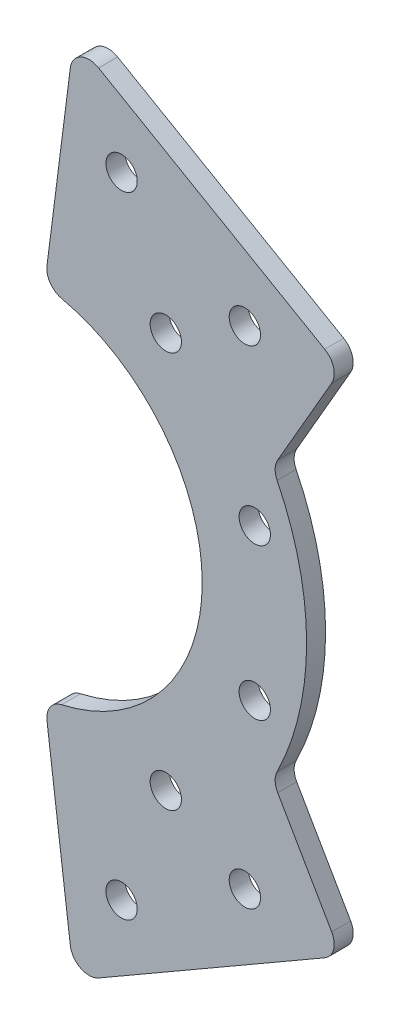
ISO-10303-21;
HEADER;
FILE_DESCRIPTION(('STEP AP214'),'2;1');
FILE_NAME('part.step','',(''),(''),'','','');
FILE_SCHEMA(('AUTOMOTIVE_DESIGN { 1 0 10303 214 1 1 1 1 }'));
ENDSEC;
DATA;
#1=APPLICATION_CONTEXT('core data for automotive mechanical design processes');
#2=APPLICATION_PROTOCOL_DEFINITION('international standard','automotive_design',2000,#1);
#3=PRODUCT_CONTEXT('',#1,'mechanical');
#4=PRODUCT('Part','Part','',(#3));
#5=PRODUCT_RELATED_PRODUCT_CATEGORY('part','',(#4));
#6=PRODUCT_DEFINITION_FORMATION('','',#4);
#7=PRODUCT_DEFINITION_CONTEXT('part definition',#1,'design');
#8=PRODUCT_DEFINITION('design','',#6,#7);
#9=PRODUCT_DEFINITION_SHAPE('','',#8);
#10=(LENGTH_UNIT() NAMED_UNIT(*) SI_UNIT(.MILLI.,.METRE.));
#11=(NAMED_UNIT(*) PLANE_ANGLE_UNIT() SI_UNIT($,.RADIAN.));
#12=(NAMED_UNIT(*) SI_UNIT($,.STERADIAN.) SOLID_ANGLE_UNIT());
#13=UNCERTAINTY_MEASURE_WITH_UNIT(LENGTH_MEASURE(1.E-05),#10,'distance_accuracy_value','');
#14=(GEOMETRIC_REPRESENTATION_CONTEXT(3) GLOBAL_UNCERTAINTY_ASSIGNED_CONTEXT((#13)) GLOBAL_UNIT_ASSIGNED_CONTEXT((#10,
#11,#12)) REPRESENTATION_CONTEXT('',''));
#15=CARTESIAN_POINT('',(0.,0.,0.));
#16=DIRECTION('',(0.,0.,1.));
#17=DIRECTION('',(1.,0.,0.));
#18=AXIS2_PLACEMENT_3D('',#15,#16,#17);
#19=CARTESIAN_POINT('',(9.25678849025438,-40.9672047721918,4.));
#20=DIRECTION('',(0.,0.,1.));
#21=DIRECTION('',(1.,0.,0.));
#22=AXIS2_PLACEMENT_3D('',#19,#20,#21);
#23=PLANE('',#22);
#24=CARTESIAN_POINT('',(46.9903810567668,-51.3897274573416,4.));
#25=DIRECTION('',(0.,0.,1.));
#26=DIRECTION('',(-1.,0.,0.));
#27=AXIS2_PLACEMENT_3D('',#24,#25,#26);
#28=CIRCLE('',#27,3.3);
#29=CARTESIAN_POINT('',(43.6903810567668,-51.3897274573416,4.));
#30=VERTEX_POINT('',#29);
#31=EDGE_CURVE('E358',#30,#30,#28,.T.);
#32=ORIENTED_EDGE('',*,*,#31,.F.);
#33=EDGE_LOOP('',(#32));
#34=FACE_BOUND('',#33,.T.);
#35=CARTESIAN_POINT('',(21.0096189432338,66.3897274573417,4.));
#36=DIRECTION('',(0.,0.,1.));
#37=DIRECTION('',(1.,0.,0.));
#38=AXIS2_PLACEMENT_3D('',#35,#36,#37);
#39=CIRCLE('',#38,3.3);
#40=CARTESIAN_POINT('',(24.3096189432338,66.3897274573417,4.));
#41=VERTEX_POINT('',#40);
#42=EDGE_CURVE('E370',#41,#41,#39,.T.);
#43=ORIENTED_EDGE('',*,*,#42,.F.);
#44=EDGE_LOOP('',(#43));
#45=FACE_BOUND('',#44,.T.);
#46=CARTESIAN_POINT('',(49.0745162408299,-15.9452769097473,4.));
#47=DIRECTION('',(0.,0.,1.));
#48=DIRECTION('',(1.,0.,0.));
#49=AXIS2_PLACEMENT_3D('',#46,#47,#48);
#50=CIRCLE('',#49,3.3);
#51=CARTESIAN_POINT('',(52.3745162408299,-15.9452769097473,4.));
#52=VERTEX_POINT('',#51);
#53=EDGE_CURVE('E382',#52,#52,#50,.T.);
#54=ORIENTED_EDGE('',*,*,#53,.F.);
#55=EDGE_LOOP('',(#54));
#56=FACE_BOUND('',#55,.T.);
#57=CARTESIAN_POINT('',(30.3297190182916,41.7452769097473,4.));
#58=DIRECTION('',(0.,0.,1.));
#59=DIRECTION('',(1.,0.,0.));
#60=AXIS2_PLACEMENT_3D('',#57,#58,#59);
#61=CIRCLE('',#60,3.3);
#62=CARTESIAN_POINT('',(33.6297190182916,41.7452769097473,4.));
#63=VERTEX_POINT('',#62);
#64=EDGE_CURVE('E181',#63,#63,#61,.T.);
#65=ORIENTED_EDGE('',*,*,#64,.F.);
#66=EDGE_LOOP('',(#65));
#67=FACE_BOUND('',#66,.T.);
#68=CARTESIAN_POINT('',(9.25678849025438,-40.9672047721918,4.));
#69=DIRECTION('',(0.,0.,1.));
#70=DIRECTION('',(1.,0.,0.));
#71=AXIS2_PLACEMENT_3D('',#68,#69,#70);
#72=CIRCLE('',#71,3.99999999999999);
#73=CARTESIAN_POINT('',(8.37518958642063,-37.0655662224592,4.));
#74=VERTEX_POINT('',#73);
#75=CARTESIAN_POINT('',(5.2889229526519,-41.4732117637507,4.));
#76=VERTEX_POINT('',#75);
#77=EDGE_CURVE('E208',#74,#76,#72,.T.);
#78=ORIENTED_EDGE('',*,*,#77,.T.);
#79=DIRECTION('',(0.126501747889734,-0.991966384400622,0.));
#80=VECTOR('',#79,1.);
#81=CARTESIAN_POINT('',(5.2889229526519,-41.4732117637507,4.));
#82=LINE('',#81,#80);
#83=CARTESIAN_POINT('',(10.2118651043846,-80.0765766051946,4.));
#84=VERTEX_POINT('',#83);
#85=EDGE_CURVE('E116',#76,#84,#82,.T.);
#86=ORIENTED_EDGE('',*,*,#85,.T.);
#87=CARTESIAN_POINT('',(14.1797306419871,-79.5705696136356,4.));
#88=DIRECTION('',(0.,0.,1.));
#89=DIRECTION('',(1.,0.,0.));
#90=AXIS2_PLACEMENT_3D('',#87,#88,#89);
#91=CIRCLE('',#90,4.00000000000001);
#92=CARTESIAN_POINT('',(16.1797306419872,-83.0346712287734,4.));
#93=VERTEX_POINT('',#92);
#94=EDGE_CURVE('E247',#84,#93,#91,.T.);
#95=ORIENTED_EDGE('',*,*,#94,.T.);
#96=DIRECTION('',(0.866025403784436,0.500000000000005,0.));
#97=VECTOR('',#96,1.);
#98=CARTESIAN_POINT('',(16.1797306419872,-83.0346712287734,4.));
#99=LINE('',#98,#97);
#100=CARTESIAN_POINT('',(63.8202693580135,-55.5293933767364,4.));
#101=VERTEX_POINT('',#100);
#102=EDGE_CURVE('E266',#93,#101,#99,.T.);
#103=ORIENTED_EDGE('',*,*,#102,.T.);
#104=CARTESIAN_POINT('',(61.8202693580135,-52.0652917615987,4.));
#105=DIRECTION('',(0.,0.,1.));
#106=DIRECTION('',(-1.,0.,0.));
#107=AXIS2_PLACEMENT_3D('',#104,#105,#106);
#108=CIRCLE('',#107,4.);
#109=CARTESIAN_POINT('',(65.2843709731513,-50.0652917615987,4.));
#110=VERTEX_POINT('',#109);
#111=EDGE_CURVE('E263',#101,#110,#108,.T.);
#112=ORIENTED_EDGE('',*,*,#111,.T.);
#113=DIRECTION('',(-0.500000000000004,0.866025403784436,0.));
#114=VECTOR('',#113,1.);
#115=CARTESIAN_POINT('',(65.2843709731513,-50.0652917615987,4.));
#116=LINE('',#115,#114);
#117=CARTESIAN_POINT('',(53.9084918255365,-30.3616910971668,4.));
#118=VERTEX_POINT('',#117);
#119=EDGE_CURVE('E265',#110,#118,#116,.T.);
#120=ORIENTED_EDGE('',*,*,#119,.T.);
#121=CARTESIAN_POINT('',(57.3725934406742,-28.3616910971667,4.));
#122=DIRECTION('',(0.,0.,-1.));
#123=DIRECTION('',(1.,0.,0.));
#124=AXIS2_PLACEMENT_3D('',#121,#122,#123);
#125=CIRCLE('',#124,4.00000000000002);
#126=CARTESIAN_POINT('',(53.7868063506321,-26.5890854035938,4.));
#127=VERTEX_POINT('',#126);
#128=EDGE_CURVE('E268',#118,#127,#125,.T.);
#129=ORIENTED_EDGE('',*,*,#128,.T.);
#130=CARTESIAN_POINT('',(0.,0.,4.));
#131=DIRECTION('',(0.,0.,1.));
#132=DIRECTION('',(-1.,0.,0.));
#133=AXIS2_PLACEMENT_3D('',#130,#131,#132);
#134=CIRCLE('',#133,60.);
#135=CARTESIAN_POINT('',(53.7868063506321,26.5890854035938,4.));
#136=VERTEX_POINT('',#135);
#137=EDGE_CURVE('E274',#127,#136,#134,.T.);
#138=ORIENTED_EDGE('',*,*,#137,.T.);
#139=CARTESIAN_POINT('',(57.3725934406742,28.3616910971667,4.));
#140=DIRECTION('',(0.,0.,-1.));
#141=DIRECTION('',(-1.,0.,0.));
#142=AXIS2_PLACEMENT_3D('',#139,#140,#141);
#143=CIRCLE('',#142,4.00000000000001);
#144=CARTESIAN_POINT('',(53.9084918255364,30.3616910971668,4.));
#145=VERTEX_POINT('',#144);
#146=EDGE_CURVE('E276',#136,#145,#143,.T.);
#147=ORIENTED_EDGE('',*,*,#146,.T.);
#148=DIRECTION('',(0.500000000000004,0.866025403784436,0.));
#149=VECTOR('',#148,1.);
#150=CARTESIAN_POINT('',(65.2843709731512,50.0652917615987,4.));
#151=LINE('',#150,#149);
#152=CARTESIAN_POINT('',(65.2843709731512,50.0652917615987,4.));
#153=VERTEX_POINT('',#152);
#154=EDGE_CURVE('E278',#145,#153,#151,.T.);
#155=ORIENTED_EDGE('',*,*,#154,.T.);
#156=CARTESIAN_POINT('',(61.8202693580135,52.0652917615987,4.));
#157=DIRECTION('',(0.,0.,1.));
#158=DIRECTION('',(1.,0.,0.));
#159=AXIS2_PLACEMENT_3D('',#156,#157,#158);
#160=CIRCLE('',#159,3.99999999999999);
#161=CARTESIAN_POINT('',(63.8202693580135,55.5293933767364,4.));
#162=VERTEX_POINT('',#161);
#163=EDGE_CURVE('E280',#153,#162,#160,.T.);
#164=ORIENTED_EDGE('',*,*,#163,.T.);
#165=DIRECTION('',(-0.866025403784436,0.500000000000004,0.));
#166=VECTOR('',#165,1.);
#167=CARTESIAN_POINT('',(16.1797306419872,83.0346712287733,4.));
#168=LINE('',#167,#166);
#169=CARTESIAN_POINT('',(16.1797306419872,83.0346712287733,4.));
#170=VERTEX_POINT('',#169);
#171=EDGE_CURVE('E282',#162,#170,#168,.T.);
#172=ORIENTED_EDGE('',*,*,#171,.T.);
#173=CARTESIAN_POINT('',(14.1797306419871,79.5705696136356,4.));
#174=DIRECTION('',(0.,0.,1.));
#175=DIRECTION('',(-1.,0.,0.));
#176=AXIS2_PLACEMENT_3D('',#173,#174,#175);
#177=CIRCLE('',#176,3.99999999999999);
#178=CARTESIAN_POINT('',(10.2118651043846,80.0765766051945,4.));
#179=VERTEX_POINT('',#178);
#180=EDGE_CURVE('E159',#170,#179,#177,.T.);
#181=ORIENTED_EDGE('',*,*,#180,.T.);
#182=DIRECTION('',(-0.126501747889734,-0.991966384400622,0.));
#183=VECTOR('',#182,1.);
#184=CARTESIAN_POINT('',(5.28892295265189,41.4732117637507,4.));
#185=LINE('',#184,#183);
#186=CARTESIAN_POINT('',(5.28892295265189,41.4732117637507,4.));
#187=VERTEX_POINT('',#186);
#188=EDGE_CURVE('E153',#179,#187,#185,.T.);
#189=ORIENTED_EDGE('',*,*,#188,.T.);
#190=CARTESIAN_POINT('',(9.25678849025437,40.9672047721918,4.));
#191=DIRECTION('',(0.,0.,1.));
#192=DIRECTION('',(-1.,0.,0.));
#193=AXIS2_PLACEMENT_3D('',#190,#191,#192);
#194=CIRCLE('',#193,4.);
#195=CARTESIAN_POINT('',(8.37518958642062,37.0655662224593,4.));
#196=VERTEX_POINT('',#195);
#197=EDGE_CURVE('E157',#187,#196,#194,.T.);
#198=ORIENTED_EDGE('',*,*,#197,.T.);
#199=CARTESIAN_POINT('',(0.,0.,4.));
#200=DIRECTION('',(0.,0.,-1.));
#201=DIRECTION('',(-1.,0.,0.));
#202=AXIS2_PLACEMENT_3D('',#199,#200,#201);
#203=CIRCLE('',#202,38.);
#204=EDGE_CURVE('E49',#196,#74,#203,.T.);
#205=ORIENTED_EDGE('',*,*,#204,.T.);
#206=EDGE_LOOP('',(#78,#86,#95,#103,#112,#120,#129,#138,#147,#155,#164,#172,#181,#189,#198,#205));
#207=FACE_BOUND('',#206,.T.);
#208=CARTESIAN_POINT('',(49.0745162408299,15.9452769097473,4.));
#209=DIRECTION('',(0.,0.,1.));
#210=DIRECTION('',(1.,0.,0.));
#211=AXIS2_PLACEMENT_3D('',#208,#209,#210);
#212=CIRCLE('',#211,3.29999999999999);
#213=CARTESIAN_POINT('',(52.3745162408299,15.9452769097473,4.));
#214=VERTEX_POINT('',#213);
#215=EDGE_CURVE('E388',#214,#214,#212,.T.);
#216=ORIENTED_EDGE('',*,*,#215,.F.);
#217=EDGE_LOOP('',(#216));
#218=FACE_BOUND('',#217,.T.);
#219=CARTESIAN_POINT('',(30.3297190182916,-41.7452769097473,4.));
#220=DIRECTION('',(0.,0.,1.));
#221=DIRECTION('',(1.,0.,0.));
#222=AXIS2_PLACEMENT_3D('',#219,#220,#221);
#223=CIRCLE('',#222,3.29999999999999);
#224=CARTESIAN_POINT('',(33.6297190182916,-41.7452769097473,4.));
#225=VERTEX_POINT('',#224);
#226=EDGE_CURVE('E376',#225,#225,#223,.T.);
#227=ORIENTED_EDGE('',*,*,#226,.F.);
#228=EDGE_LOOP('',(#227));
#229=FACE_BOUND('',#228,.T.);
#230=CARTESIAN_POINT('',(46.9903810567668,51.3897274573416,4.));
#231=DIRECTION('',(0.,0.,1.));
#232=DIRECTION('',(1.,0.,0.));
#233=AXIS2_PLACEMENT_3D('',#230,#231,#232);
#234=CIRCLE('',#233,3.3);
#235=CARTESIAN_POINT('',(50.2903810567668,51.3897274573416,4.));
#236=VERTEX_POINT('',#235);
#237=EDGE_CURVE('E364',#236,#236,#234,.T.);
#238=ORIENTED_EDGE('',*,*,#237,.F.);
#239=EDGE_LOOP('',(#238));
#240=FACE_BOUND('',#239,.T.);
#241=CARTESIAN_POINT('',(21.0096189432338,-66.3897274573417,4.));
#242=DIRECTION('',(0.,0.,1.));
#243=DIRECTION('',(-1.,0.,0.));
#244=AXIS2_PLACEMENT_3D('',#241,#242,#243);
#245=CIRCLE('',#244,3.3);
#246=CARTESIAN_POINT('',(17.7096189432337,-66.3897274573417,4.));
#247=VERTEX_POINT('',#246);
#248=EDGE_CURVE('E349',#247,#247,#245,.T.);
#249=ORIENTED_EDGE('',*,*,#248,.F.);
#250=EDGE_LOOP('',(#249));
#251=FACE_BOUND('',#250,.T.);
#252=ADVANCED_FACE('F32',(#34,#45,#56,#67,#207,#218,#229,#240,#251),#23,.T.);
#253=CARTESIAN_POINT('',(9.25678849025438,-40.9672047721918,0.));
#254=DIRECTION('',(0.,0.,1.));
#255=DIRECTION('',(1.,0.,0.));
#256=AXIS2_PLACEMENT_3D('',#253,#254,#255);
#257=PLANE('',#256);
#258=CARTESIAN_POINT('',(9.25678849025438,-40.9672047721918,0.));
#259=DIRECTION('',(0.,0.,1.));
#260=DIRECTION('',(1.,0.,0.));
#261=AXIS2_PLACEMENT_3D('',#258,#259,#260);
#262=CIRCLE('',#261,3.99999999999999);
#263=CARTESIAN_POINT('',(8.37518958642063,-37.0655662224592,0.));
#264=VERTEX_POINT('',#263);
#265=CARTESIAN_POINT('',(5.2889229526519,-41.4732117637507,0.));
#266=VERTEX_POINT('',#265);
#267=EDGE_CURVE('E177',#264,#266,#262,.T.);
#268=ORIENTED_EDGE('',*,*,#267,.F.);
#269=CARTESIAN_POINT('',(0.,0.,0.));
#270=DIRECTION('',(0.,0.,-1.));
#271=DIRECTION('',(-1.,0.,0.));
#272=AXIS2_PLACEMENT_3D('',#269,#270,#271);
#273=CIRCLE('',#272,38.);
#274=CARTESIAN_POINT('',(8.37518958642062,37.0655662224593,0.));
#275=VERTEX_POINT('',#274);
#276=EDGE_CURVE('E108',#275,#264,#273,.T.);
#277=ORIENTED_EDGE('',*,*,#276,.F.);
#278=CARTESIAN_POINT('',(9.25678849025437,40.9672047721918,0.));
#279=DIRECTION('',(0.,0.,1.));
#280=DIRECTION('',(-1.,0.,0.));
#281=AXIS2_PLACEMENT_3D('',#278,#279,#280);
#282=CIRCLE('',#281,4.);
#283=CARTESIAN_POINT('',(5.28892295265189,41.4732117637507,0.));
#284=VERTEX_POINT('',#283);
#285=EDGE_CURVE('E102',#284,#275,#282,.T.);
#286=ORIENTED_EDGE('',*,*,#285,.F.);
#287=DIRECTION('',(-0.126501747889734,-0.991966384400622,0.));
#288=VECTOR('',#287,1.);
#289=CARTESIAN_POINT('',(5.28892295265189,41.4732117637507,0.));
#290=LINE('',#289,#288);
#291=CARTESIAN_POINT('',(10.2118651043846,80.0765766051945,0.));
#292=VERTEX_POINT('',#291);
#293=EDGE_CURVE('E167',#292,#284,#290,.T.);
#294=ORIENTED_EDGE('',*,*,#293,.F.);
#295=CARTESIAN_POINT('',(14.1797306419871,79.5705696136356,0.));
#296=DIRECTION('',(0.,0.,1.));
#297=DIRECTION('',(-1.,0.,0.));
#298=AXIS2_PLACEMENT_3D('',#295,#296,#297);
#299=CIRCLE('',#298,3.99999999999999);
#300=CARTESIAN_POINT('',(16.1797306419872,83.0346712287733,0.));
#301=VERTEX_POINT('',#300);
#302=EDGE_CURVE('E203',#301,#292,#299,.T.);
#303=ORIENTED_EDGE('',*,*,#302,.F.);
#304=DIRECTION('',(-0.866025403784436,0.500000000000004,0.));
#305=VECTOR('',#304,1.);
#306=CARTESIAN_POINT('',(16.1797306419872,83.0346712287733,0.));
#307=LINE('',#306,#305);
#308=CARTESIAN_POINT('',(63.8202693580135,55.5293933767364,0.));
#309=VERTEX_POINT('',#308);
#310=EDGE_CURVE('E201',#309,#301,#307,.T.);
#311=ORIENTED_EDGE('',*,*,#310,.F.);
#312=CARTESIAN_POINT('',(61.8202693580135,52.0652917615987,0.));
#313=DIRECTION('',(0.,0.,1.));
#314=DIRECTION('',(1.,0.,0.));
#315=AXIS2_PLACEMENT_3D('',#312,#313,#314);
#316=CIRCLE('',#315,3.99999999999999);
#317=CARTESIAN_POINT('',(65.2843709731512,50.0652917615987,0.));
#318=VERTEX_POINT('',#317);
#319=EDGE_CURVE('E199',#318,#309,#316,.T.);
#320=ORIENTED_EDGE('',*,*,#319,.F.);
#321=DIRECTION('',(0.500000000000004,0.866025403784436,0.));
#322=VECTOR('',#321,1.);
#323=CARTESIAN_POINT('',(65.2843709731512,50.0652917615987,0.));
#324=LINE('',#323,#322);
#325=CARTESIAN_POINT('',(53.9084918255364,30.3616910971668,0.));
#326=VERTEX_POINT('',#325);
#327=EDGE_CURVE('E197',#326,#318,#324,.T.);
#328=ORIENTED_EDGE('',*,*,#327,.F.);
#329=CARTESIAN_POINT('',(57.3725934406742,28.3616910971667,0.));
#330=DIRECTION('',(0.,0.,-1.));
#331=DIRECTION('',(-1.,0.,0.));
#332=AXIS2_PLACEMENT_3D('',#329,#330,#331);
#333=CIRCLE('',#332,4.00000000000001);
#334=CARTESIAN_POINT('',(53.7868063506321,26.5890854035938,0.));
#335=VERTEX_POINT('',#334);
#336=EDGE_CURVE('E195',#335,#326,#333,.T.);
#337=ORIENTED_EDGE('',*,*,#336,.F.);
#338=CARTESIAN_POINT('',(0.,0.,0.));
#339=DIRECTION('',(0.,0.,1.));
#340=DIRECTION('',(-1.,0.,0.));
#341=AXIS2_PLACEMENT_3D('',#338,#339,#340);
#342=CIRCLE('',#341,60.);
#343=CARTESIAN_POINT('',(53.7868063506321,-26.5890854035938,0.));
#344=VERTEX_POINT('',#343);
#345=EDGE_CURVE('E193',#344,#335,#342,.T.);
#346=ORIENTED_EDGE('',*,*,#345,.F.);
#347=CARTESIAN_POINT('',(57.3725934406742,-28.3616910971667,0.));
#348=DIRECTION('',(0.,0.,-1.));
#349=DIRECTION('',(1.,0.,0.));
#350=AXIS2_PLACEMENT_3D('',#347,#348,#349);
#351=CIRCLE('',#350,4.00000000000002);
#352=CARTESIAN_POINT('',(53.9084918255365,-30.3616910971668,0.));
#353=VERTEX_POINT('',#352);
#354=EDGE_CURVE('E191',#353,#344,#351,.T.);
#355=ORIENTED_EDGE('',*,*,#354,.F.);
#356=DIRECTION('',(-0.500000000000004,0.866025403784436,0.));
#357=VECTOR('',#356,1.);
#358=CARTESIAN_POINT('',(65.2843709731513,-50.0652917615987,0.));
#359=LINE('',#358,#357);
#360=CARTESIAN_POINT('',(65.2843709731513,-50.0652917615987,0.));
#361=VERTEX_POINT('',#360);
#362=EDGE_CURVE('E189',#361,#353,#359,.T.);
#363=ORIENTED_EDGE('',*,*,#362,.F.);
#364=CARTESIAN_POINT('',(61.8202693580135,-52.0652917615987,0.));
#365=DIRECTION('',(0.,0.,1.));
#366=DIRECTION('',(-1.,0.,0.));
#367=AXIS2_PLACEMENT_3D('',#364,#365,#366);
#368=CIRCLE('',#367,4.);
#369=CARTESIAN_POINT('',(63.8202693580135,-55.5293933767364,0.));
#370=VERTEX_POINT('',#369);
#371=EDGE_CURVE('E187',#370,#361,#368,.T.);
#372=ORIENTED_EDGE('',*,*,#371,.F.);
#373=DIRECTION('',(0.866025403784436,0.500000000000005,0.));
#374=VECTOR('',#373,1.);
#375=CARTESIAN_POINT('',(16.1797306419872,-83.0346712287734,0.));
#376=LINE('',#375,#374);
#377=CARTESIAN_POINT('',(16.1797306419872,-83.0346712287734,0.));
#378=VERTEX_POINT('',#377);
#379=EDGE_CURVE('E185',#378,#370,#376,.T.);
#380=ORIENTED_EDGE('',*,*,#379,.F.);
#381=CARTESIAN_POINT('',(14.1797306419871,-79.5705696136356,0.));
#382=DIRECTION('',(0.,0.,1.));
#383=DIRECTION('',(1.,0.,0.));
#384=AXIS2_PLACEMENT_3D('',#381,#382,#383);
#385=CIRCLE('',#384,4.00000000000001);
#386=CARTESIAN_POINT('',(10.2118651043846,-80.0765766051946,0.));
#387=VERTEX_POINT('',#386);
#388=EDGE_CURVE('E183',#387,#378,#385,.T.);
#389=ORIENTED_EDGE('',*,*,#388,.F.);
#390=DIRECTION('',(0.126501747889734,-0.991966384400622,0.));
#391=VECTOR('',#390,1.);
#392=CARTESIAN_POINT('',(5.2889229526519,-41.4732117637507,0.));
#393=LINE('',#392,#391);
#394=EDGE_CURVE('E180',#266,#387,#393,.T.);
#395=ORIENTED_EDGE('',*,*,#394,.F.);
#396=EDGE_LOOP('',(#268,#277,#286,#294,#303,#311,#320,#328,#337,#346,#355,#363,#372,#380,#389,#395));
#397=FACE_BOUND('',#396,.T.);
#398=CARTESIAN_POINT('',(30.3297190182916,41.7452769097473,0.));
#399=DIRECTION('',(0.,0.,1.));
#400=DIRECTION('',(1.,0.,0.));
#401=AXIS2_PLACEMENT_3D('',#398,#399,#400);
#402=CIRCLE('',#401,3.3);
#403=CARTESIAN_POINT('',(33.6297190182916,41.7452769097473,0.));
#404=VERTEX_POINT('',#403);
#405=EDGE_CURVE('E391',#404,#404,#402,.T.);
#406=ORIENTED_EDGE('',*,*,#405,.T.);
#407=EDGE_LOOP('',(#406));
#408=FACE_BOUND('',#407,.T.);
#409=CARTESIAN_POINT('',(49.0745162408299,15.9452769097473,0.));
#410=DIRECTION('',(0.,0.,1.));
#411=DIRECTION('',(1.,0.,0.));
#412=AXIS2_PLACEMENT_3D('',#409,#410,#411);
#413=CIRCLE('',#412,3.29999999999999);
#414=CARTESIAN_POINT('',(52.3745162408299,15.9452769097473,0.));
#415=VERTEX_POINT('',#414);
#416=EDGE_CURVE('E385',#415,#415,#413,.T.);
#417=ORIENTED_EDGE('',*,*,#416,.T.);
#418=EDGE_LOOP('',(#417));
#419=FACE_BOUND('',#418,.T.);
#420=CARTESIAN_POINT('',(49.0745162408299,-15.9452769097473,0.));
#421=DIRECTION('',(0.,0.,1.));
#422=DIRECTION('',(1.,0.,0.));
#423=AXIS2_PLACEMENT_3D('',#420,#421,#422);
#424=CIRCLE('',#423,3.3);
#425=CARTESIAN_POINT('',(52.3745162408299,-15.9452769097473,0.));
#426=VERTEX_POINT('',#425);
#427=EDGE_CURVE('E379',#426,#426,#424,.T.);
#428=ORIENTED_EDGE('',*,*,#427,.T.);
#429=EDGE_LOOP('',(#428));
#430=FACE_BOUND('',#429,.T.);
#431=CARTESIAN_POINT('',(30.3297190182916,-41.7452769097473,0.));
#432=DIRECTION('',(0.,0.,1.));
#433=DIRECTION('',(1.,0.,0.));
#434=AXIS2_PLACEMENT_3D('',#431,#432,#433);
#435=CIRCLE('',#434,3.29999999999999);
#436=CARTESIAN_POINT('',(33.6297190182916,-41.7452769097473,0.));
#437=VERTEX_POINT('',#436);
#438=EDGE_CURVE('E373',#437,#437,#435,.T.);
#439=ORIENTED_EDGE('',*,*,#438,.T.);
#440=EDGE_LOOP('',(#439));
#441=FACE_BOUND('',#440,.T.);
#442=CARTESIAN_POINT('',(21.0096189432338,66.3897274573417,0.));
#443=DIRECTION('',(0.,0.,1.));
#444=DIRECTION('',(1.,0.,0.));
#445=AXIS2_PLACEMENT_3D('',#442,#443,#444);
#446=CIRCLE('',#445,3.3);
#447=CARTESIAN_POINT('',(24.3096189432338,66.3897274573417,0.));
#448=VERTEX_POINT('',#447);
#449=EDGE_CURVE('E367',#448,#448,#446,.T.);
#450=ORIENTED_EDGE('',*,*,#449,.T.);
#451=EDGE_LOOP('',(#450));
#452=FACE_BOUND('',#451,.T.);
#453=CARTESIAN_POINT('',(46.9903810567668,51.3897274573416,0.));
#454=DIRECTION('',(0.,0.,1.));
#455=DIRECTION('',(1.,0.,0.));
#456=AXIS2_PLACEMENT_3D('',#453,#454,#455);
#457=CIRCLE('',#456,3.3);
#458=CARTESIAN_POINT('',(50.2903810567668,51.3897274573416,0.));
#459=VERTEX_POINT('',#458);
#460=EDGE_CURVE('E361',#459,#459,#457,.T.);
#461=ORIENTED_EDGE('',*,*,#460,.T.);
#462=EDGE_LOOP('',(#461));
#463=FACE_BOUND('',#462,.T.);
#464=CARTESIAN_POINT('',(46.9903810567668,-51.3897274573416,0.));
#465=DIRECTION('',(0.,0.,1.));
#466=DIRECTION('',(-1.,0.,0.));
#467=AXIS2_PLACEMENT_3D('',#464,#465,#466);
#468=CIRCLE('',#467,3.3);
#469=CARTESIAN_POINT('',(43.6903810567668,-51.3897274573416,0.));
#470=VERTEX_POINT('',#469);
#471=EDGE_CURVE('E355',#470,#470,#468,.T.);
#472=ORIENTED_EDGE('',*,*,#471,.T.);
#473=EDGE_LOOP('',(#472));
#474=FACE_BOUND('',#473,.T.);
#475=CARTESIAN_POINT('',(21.0096189432338,-66.3897274573417,0.));
#476=DIRECTION('',(0.,0.,1.));
#477=DIRECTION('',(-1.,0.,0.));
#478=AXIS2_PLACEMENT_3D('',#475,#476,#477);
#479=CIRCLE('',#478,3.3);
#480=CARTESIAN_POINT('',(17.7096189432337,-66.3897274573417,0.));
#481=VERTEX_POINT('',#480);
#482=EDGE_CURVE('E352',#481,#481,#479,.T.);
#483=ORIENTED_EDGE('',*,*,#482,.T.);
#484=EDGE_LOOP('',(#483));
#485=FACE_BOUND('',#484,.T.);
#486=ADVANCED_FACE('F251',(#397,#408,#419,#430,#441,#452,#463,#474,#485),#257,.F.);
#487=CARTESIAN_POINT('',(9.25678849025438,-40.9672047721918,4.));
#488=DIRECTION('',(0.,0.,-1.));
#489=DIRECTION('',(-1.,0.,0.));
#490=AXIS2_PLACEMENT_3D('',#487,#488,#489);
#491=CYLINDRICAL_SURFACE('',#490,3.99999999999999);
#492=ORIENTED_EDGE('',*,*,#267,.T.);
#493=DIRECTION('',(0.,0.,-1.));
#494=VECTOR('',#493,1.);
#495=CARTESIAN_POINT('',(5.2889229526519,-41.4732117637507,4.));
#496=LINE('',#495,#494);
#497=EDGE_CURVE('E11',#76,#266,#496,.T.);
#498=ORIENTED_EDGE('',*,*,#497,.F.);
#499=ORIENTED_EDGE('',*,*,#77,.F.);
#500=DIRECTION('',(0.,0.,-1.));
#501=VECTOR('',#500,1.);
#502=CARTESIAN_POINT('',(8.37518958642063,-37.0655662224592,4.));
#503=LINE('',#502,#501);
#504=EDGE_CURVE('E173',#74,#264,#503,.T.);
#505=ORIENTED_EDGE('',*,*,#504,.T.);
#506=EDGE_LOOP('',(#492,#498,#499,#505));
#507=FACE_BOUND('',#506,.T.);
#508=ADVANCED_FACE('F34',(#507),#491,.T.);
#509=CARTESIAN_POINT('',(5.2889229526519,-41.4732117637507,4.));
#510=DIRECTION('',(0.991966384400622,0.126501747889734,0.));
#511=DIRECTION('',(-0.126501747889734,0.991966384400622,0.));
#512=AXIS2_PLACEMENT_3D('',#509,#510,#511);
#513=PLANE('',#512);
#514=ORIENTED_EDGE('',*,*,#394,.T.);
#515=DIRECTION('',(0.,0.,-1.));
#516=VECTOR('',#515,1.);
#517=CARTESIAN_POINT('',(10.2118651043846,-80.0765766051946,4.));
#518=LINE('',#517,#516);
#519=EDGE_CURVE('E41',#84,#387,#518,.T.);
#520=ORIENTED_EDGE('',*,*,#519,.F.);
#521=ORIENTED_EDGE('',*,*,#85,.F.);
#522=ORIENTED_EDGE('',*,*,#497,.T.);
#523=EDGE_LOOP('',(#514,#520,#521,#522));
#524=FACE_BOUND('',#523,.T.);
#525=ADVANCED_FACE('F577',(#524),#513,.F.);
#526=CARTESIAN_POINT('',(14.1797306419871,-79.5705696136356,4.));
#527=DIRECTION('',(0.,0.,-1.));
#528=DIRECTION('',(-1.,0.,0.));
#529=AXIS2_PLACEMENT_3D('',#526,#527,#528);
#530=CYLINDRICAL_SURFACE('',#529,4.00000000000001);
#531=ORIENTED_EDGE('',*,*,#388,.T.);
#532=DIRECTION('',(0.,0.,-1.));
#533=VECTOR('',#532,1.);
#534=CARTESIAN_POINT('',(16.1797306419872,-83.0346712287734,4.));
#535=LINE('',#534,#533);
#536=EDGE_CURVE('E239',#93,#378,#535,.T.);
#537=ORIENTED_EDGE('',*,*,#536,.F.);
#538=ORIENTED_EDGE('',*,*,#94,.F.);
#539=ORIENTED_EDGE('',*,*,#519,.T.);
#540=EDGE_LOOP('',(#531,#537,#538,#539));
#541=FACE_BOUND('',#540,.T.);
#542=ADVANCED_FACE('F245',(#541),#530,.T.);
#543=CARTESIAN_POINT('',(16.1797306419872,-83.0346712287734,4.));
#544=DIRECTION('',(-0.500000000000005,0.866025403784436,0.));
#545=DIRECTION('',(-0.866025403784436,-0.500000000000005,0.));
#546=AXIS2_PLACEMENT_3D('',#543,#544,#545);
#547=PLANE('',#546);
#548=ORIENTED_EDGE('',*,*,#379,.T.);
#549=DIRECTION('',(0.,0.,-1.));
#550=VECTOR('',#549,1.);
#551=CARTESIAN_POINT('',(63.8202693580135,-55.5293933767364,4.));
#552=LINE('',#551,#550);
#553=EDGE_CURVE('E236',#101,#370,#552,.T.);
#554=ORIENTED_EDGE('',*,*,#553,.F.);
#555=ORIENTED_EDGE('',*,*,#102,.F.);
#556=ORIENTED_EDGE('',*,*,#536,.T.);
#557=EDGE_LOOP('',(#548,#554,#555,#556));
#558=FACE_BOUND('',#557,.T.);
#559=ADVANCED_FACE('F257',(#558),#547,.F.);
#560=CARTESIAN_POINT('',(61.8202693580135,-52.0652917615987,4.));
#561=DIRECTION('',(0.,0.,-1.));
#562=DIRECTION('',(-1.,0.,0.));
#563=AXIS2_PLACEMENT_3D('',#560,#561,#562);
#564=CYLINDRICAL_SURFACE('',#563,4.);
#565=ORIENTED_EDGE('',*,*,#371,.T.);
#566=DIRECTION('',(0.,0.,-1.));
#567=VECTOR('',#566,1.);
#568=CARTESIAN_POINT('',(65.2843709731513,-50.0652917615987,4.));
#569=LINE('',#568,#567);
#570=EDGE_CURVE('E233',#110,#361,#569,.T.);
#571=ORIENTED_EDGE('',*,*,#570,.F.);
#572=ORIENTED_EDGE('',*,*,#111,.F.);
#573=ORIENTED_EDGE('',*,*,#553,.T.);
#574=EDGE_LOOP('',(#565,#571,#572,#573));
#575=FACE_BOUND('',#574,.T.);
#576=ADVANCED_FACE('F261',(#575),#564,.T.);
#577=CARTESIAN_POINT('',(65.2843709731513,-50.0652917615987,4.));
#578=DIRECTION('',(-0.866025403784436,-0.500000000000004,0.));
#579=DIRECTION('',(0.500000000000004,-0.866025403784436,0.));
#580=AXIS2_PLACEMENT_3D('',#577,#578,#579);
#581=PLANE('',#580);
#582=ORIENTED_EDGE('',*,*,#362,.T.);
#583=DIRECTION('',(0.,0.,-1.));
#584=VECTOR('',#583,1.);
#585=CARTESIAN_POINT('',(53.9084918255365,-30.3616910971668,4.));
#586=LINE('',#585,#584);
#587=EDGE_CURVE('E230',#118,#353,#586,.T.);
#588=ORIENTED_EDGE('',*,*,#587,.F.);
#589=ORIENTED_EDGE('',*,*,#119,.F.);
#590=ORIENTED_EDGE('',*,*,#570,.T.);
#591=EDGE_LOOP('',(#582,#588,#589,#590));
#592=FACE_BOUND('',#591,.T.);
#593=ADVANCED_FACE('F542',(#592),#581,.F.);
#594=CARTESIAN_POINT('',(57.3725934406742,-28.3616910971667,4.));
#595=DIRECTION('',(0.,0.,-1.));
#596=DIRECTION('',(-1.,0.,0.));
#597=AXIS2_PLACEMENT_3D('',#594,#595,#596);
#598=CYLINDRICAL_SURFACE('',#597,4.00000000000002);
#599=ORIENTED_EDGE('',*,*,#354,.T.);
#600=DIRECTION('',(0.,0.,-1.));
#601=VECTOR('',#600,1.);
#602=CARTESIAN_POINT('',(53.7868063506321,-26.5890854035938,4.));
#603=LINE('',#602,#601);
#604=EDGE_CURVE('E227',#127,#344,#603,.T.);
#605=ORIENTED_EDGE('',*,*,#604,.F.);
#606=ORIENTED_EDGE('',*,*,#128,.F.);
#607=ORIENTED_EDGE('',*,*,#587,.T.);
#608=EDGE_LOOP('',(#599,#605,#606,#607));
#609=FACE_BOUND('',#608,.T.);
#610=ADVANCED_FACE('F532',(#609),#598,.F.);
#611=CARTESIAN_POINT('',(0.,0.,4.));
#612=DIRECTION('',(0.,0.,-1.));
#613=DIRECTION('',(-1.,0.,0.));
#614=AXIS2_PLACEMENT_3D('',#611,#612,#613);
#615=CYLINDRICAL_SURFACE('',#614,60.);
#616=ORIENTED_EDGE('',*,*,#345,.T.);
#617=DIRECTION('',(0.,0.,-1.));
#618=VECTOR('',#617,1.);
#619=CARTESIAN_POINT('',(53.7868063506321,26.5890854035938,4.));
#620=LINE('',#619,#618);
#621=EDGE_CURVE('E224',#136,#335,#620,.T.);
#622=ORIENTED_EDGE('',*,*,#621,.F.);
#623=ORIENTED_EDGE('',*,*,#137,.F.);
#624=ORIENTED_EDGE('',*,*,#604,.T.);
#625=EDGE_LOOP('',(#616,#622,#623,#624));
#626=FACE_BOUND('',#625,.T.);
#627=ADVANCED_FACE('F522',(#626),#615,.T.);
#628=CARTESIAN_POINT('',(57.3725934406742,28.3616910971667,4.));
#629=DIRECTION('',(0.,0.,-1.));
#630=DIRECTION('',(-1.,0.,0.));
#631=AXIS2_PLACEMENT_3D('',#628,#629,#630);
#632=CYLINDRICAL_SURFACE('',#631,4.00000000000001);
#633=ORIENTED_EDGE('',*,*,#336,.T.);
#634=DIRECTION('',(0.,0.,-1.));
#635=VECTOR('',#634,1.);
#636=CARTESIAN_POINT('',(53.9084918255364,30.3616910971668,4.));
#637=LINE('',#636,#635);
#638=EDGE_CURVE('E221',#145,#326,#637,.T.);
#639=ORIENTED_EDGE('',*,*,#638,.F.);
#640=ORIENTED_EDGE('',*,*,#146,.F.);
#641=ORIENTED_EDGE('',*,*,#621,.T.);
#642=EDGE_LOOP('',(#633,#639,#640,#641));
#643=FACE_BOUND('',#642,.T.);
#644=ADVANCED_FACE('F512',(#643),#632,.F.);
#645=CARTESIAN_POINT('',(65.2843709731512,50.0652917615987,4.));
#646=DIRECTION('',(-0.866025403784436,0.500000000000004,0.));
#647=DIRECTION('',(-0.500000000000004,-0.866025403784436,0.));
#648=AXIS2_PLACEMENT_3D('',#645,#646,#647);
#649=PLANE('',#648);
#650=ORIENTED_EDGE('',*,*,#327,.T.);
#651=DIRECTION('',(0.,0.,-1.));
#652=VECTOR('',#651,1.);
#653=CARTESIAN_POINT('',(65.2843709731512,50.0652917615987,4.));
#654=LINE('',#653,#652);
#655=EDGE_CURVE('E218',#153,#318,#654,.T.);
#656=ORIENTED_EDGE('',*,*,#655,.F.);
#657=ORIENTED_EDGE('',*,*,#154,.F.);
#658=ORIENTED_EDGE('',*,*,#638,.T.);
#659=EDGE_LOOP('',(#650,#656,#657,#658));
#660=FACE_BOUND('',#659,.T.);
#661=ADVANCED_FACE('F502',(#660),#649,.F.);
#662=CARTESIAN_POINT('',(61.8202693580135,52.0652917615987,4.));
#663=DIRECTION('',(0.,0.,-1.));
#664=DIRECTION('',(-1.,0.,0.));
#665=AXIS2_PLACEMENT_3D('',#662,#663,#664);
#666=CYLINDRICAL_SURFACE('',#665,3.99999999999999);
#667=ORIENTED_EDGE('',*,*,#319,.T.);
#668=DIRECTION('',(0.,0.,-1.));
#669=VECTOR('',#668,1.);
#670=CARTESIAN_POINT('',(63.8202693580135,55.5293933767364,4.));
#671=LINE('',#670,#669);
#672=EDGE_CURVE('E215',#162,#309,#671,.T.);
#673=ORIENTED_EDGE('',*,*,#672,.F.);
#674=ORIENTED_EDGE('',*,*,#163,.F.);
#675=ORIENTED_EDGE('',*,*,#655,.T.);
#676=EDGE_LOOP('',(#667,#673,#674,#675));
#677=FACE_BOUND('',#676,.T.);
#678=ADVANCED_FACE('F493',(#677),#666,.T.);
#679=CARTESIAN_POINT('',(16.1797306419872,83.0346712287733,4.));
#680=DIRECTION('',(-0.500000000000004,-0.866025403784436,0.));
#681=DIRECTION('',(0.866025403784436,-0.500000000000004,0.));
#682=AXIS2_PLACEMENT_3D('',#679,#680,#681);
#683=PLANE('',#682);
#684=ORIENTED_EDGE('',*,*,#310,.T.);
#685=DIRECTION('',(0.,0.,-1.));
#686=VECTOR('',#685,1.);
#687=CARTESIAN_POINT('',(16.1797306419872,83.0346712287733,4.));
#688=LINE('',#687,#686);
#689=EDGE_CURVE('E212',#170,#301,#688,.T.);
#690=ORIENTED_EDGE('',*,*,#689,.F.);
#691=ORIENTED_EDGE('',*,*,#171,.F.);
#692=ORIENTED_EDGE('',*,*,#672,.T.);
#693=EDGE_LOOP('',(#684,#690,#691,#692));
#694=FACE_BOUND('',#693,.T.);
#695=ADVANCED_FACE('F288',(#694),#683,.F.);
#696=CARTESIAN_POINT('',(14.1797306419871,79.5705696136356,4.));
#697=DIRECTION('',(0.,0.,-1.));
#698=DIRECTION('',(-1.,0.,0.));
#699=AXIS2_PLACEMENT_3D('',#696,#697,#698);
#700=CYLINDRICAL_SURFACE('',#699,3.99999999999999);
#701=ORIENTED_EDGE('',*,*,#302,.T.);
#702=DIRECTION('',(0.,0.,-1.));
#703=VECTOR('',#702,1.);
#704=CARTESIAN_POINT('',(10.2118651043846,80.0765766051945,4.));
#705=LINE('',#704,#703);
#706=EDGE_CURVE('E168',#179,#292,#705,.T.);
#707=ORIENTED_EDGE('',*,*,#706,.F.);
#708=ORIENTED_EDGE('',*,*,#180,.F.);
#709=ORIENTED_EDGE('',*,*,#689,.T.);
#710=EDGE_LOOP('',(#701,#707,#708,#709));
#711=FACE_BOUND('',#710,.T.);
#712=ADVANCED_FACE('F292',(#711),#700,.T.);
#713=CARTESIAN_POINT('',(5.28892295265189,41.4732117637507,4.));
#714=DIRECTION('',(0.991966384400622,-0.126501747889734,0.));
#715=DIRECTION('',(0.126501747889734,0.991966384400622,0.));
#716=AXIS2_PLACEMENT_3D('',#713,#714,#715);
#717=PLANE('',#716);
#718=ORIENTED_EDGE('',*,*,#293,.T.);
#719=DIRECTION('',(0.,0.,-1.));
#720=VECTOR('',#719,1.);
#721=CARTESIAN_POINT('',(5.28892295265189,41.4732117637507,4.));
#722=LINE('',#721,#720);
#723=EDGE_CURVE('E164',#187,#284,#722,.T.);
#724=ORIENTED_EDGE('',*,*,#723,.F.);
#725=ORIENTED_EDGE('',*,*,#188,.F.);
#726=ORIENTED_EDGE('',*,*,#706,.T.);
#727=EDGE_LOOP('',(#718,#724,#725,#726));
#728=FACE_BOUND('',#727,.T.);
#729=ADVANCED_FACE('F165',(#728),#717,.F.);
#730=CARTESIAN_POINT('',(9.25678849025437,40.9672047721918,4.));
#731=DIRECTION('',(0.,0.,-1.));
#732=DIRECTION('',(-1.,0.,0.));
#733=AXIS2_PLACEMENT_3D('',#730,#731,#732);
#734=CYLINDRICAL_SURFACE('',#733,4.);
#735=ORIENTED_EDGE('',*,*,#285,.T.);
#736=DIRECTION('',(0.,0.,-1.));
#737=VECTOR('',#736,1.);
#738=CARTESIAN_POINT('',(8.37518958642062,37.0655662224593,4.));
#739=LINE('',#738,#737);
#740=EDGE_CURVE('E169',#196,#275,#739,.T.);
#741=ORIENTED_EDGE('',*,*,#740,.F.);
#742=ORIENTED_EDGE('',*,*,#197,.F.);
#743=ORIENTED_EDGE('',*,*,#723,.T.);
#744=EDGE_LOOP('',(#735,#741,#742,#743));
#745=FACE_BOUND('',#744,.T.);
#746=ADVANCED_FACE('F171',(#745),#734,.T.);
#747=CARTESIAN_POINT('',(0.,0.,4.));
#748=DIRECTION('',(0.,0.,-1.));
#749=DIRECTION('',(-1.,0.,0.));
#750=AXIS2_PLACEMENT_3D('',#747,#748,#749);
#751=CYLINDRICAL_SURFACE('',#750,38.);
#752=ORIENTED_EDGE('',*,*,#276,.T.);
#753=ORIENTED_EDGE('',*,*,#504,.F.);
#754=ORIENTED_EDGE('',*,*,#204,.F.);
#755=ORIENTED_EDGE('',*,*,#740,.T.);
#756=EDGE_LOOP('',(#752,#753,#754,#755));
#757=FACE_BOUND('',#756,.T.);
#758=ADVANCED_FACE('F296',(#757),#751,.F.);
#759=CARTESIAN_POINT('',(30.3297190182916,41.7452769097473,4.));
#760=DIRECTION('',(0.,0.,-1.));
#761=DIRECTION('',(-1.,0.,0.));
#762=AXIS2_PLACEMENT_3D('',#759,#760,#761);
#763=CYLINDRICAL_SURFACE('',#762,3.3);
#764=ORIENTED_EDGE('',*,*,#64,.T.);
#765=EDGE_LOOP('',(#764));
#766=FACE_BOUND('',#765,.T.);
#767=ORIENTED_EDGE('',*,*,#405,.F.);
#768=EDGE_LOOP('',(#767));
#769=FACE_BOUND('',#768,.T.);
#770=ADVANCED_FACE('F298',(#766,#769),#763,.F.);
#771=CARTESIAN_POINT('',(49.0745162408299,15.9452769097473,4.));
#772=DIRECTION('',(0.,0.,-1.));
#773=DIRECTION('',(-1.,0.,0.));
#774=AXIS2_PLACEMENT_3D('',#771,#772,#773);
#775=CYLINDRICAL_SURFACE('',#774,3.29999999999999);
#776=ORIENTED_EDGE('',*,*,#215,.T.);
#777=EDGE_LOOP('',(#776));
#778=FACE_BOUND('',#777,.T.);
#779=ORIENTED_EDGE('',*,*,#416,.F.);
#780=EDGE_LOOP('',(#779));
#781=FACE_BOUND('',#780,.T.);
#782=ADVANCED_FACE('F304',(#778,#781),#775,.F.);
#783=CARTESIAN_POINT('',(49.0745162408299,-15.9452769097473,4.));
#784=DIRECTION('',(0.,0.,-1.));
#785=DIRECTION('',(-1.,0.,0.));
#786=AXIS2_PLACEMENT_3D('',#783,#784,#785);
#787=CYLINDRICAL_SURFACE('',#786,3.3);
#788=ORIENTED_EDGE('',*,*,#53,.T.);
#789=EDGE_LOOP('',(#788));
#790=FACE_BOUND('',#789,.T.);
#791=ORIENTED_EDGE('',*,*,#427,.F.);
#792=EDGE_LOOP('',(#791));
#793=FACE_BOUND('',#792,.T.);
#794=ADVANCED_FACE('F320',(#790,#793),#787,.F.);
#795=CARTESIAN_POINT('',(30.3297190182916,-41.7452769097473,4.));
#796=DIRECTION('',(0.,0.,-1.));
#797=DIRECTION('',(-1.,0.,0.));
#798=AXIS2_PLACEMENT_3D('',#795,#796,#797);
#799=CYLINDRICAL_SURFACE('',#798,3.29999999999999);
#800=ORIENTED_EDGE('',*,*,#226,.T.);
#801=EDGE_LOOP('',(#800));
#802=FACE_BOUND('',#801,.T.);
#803=ORIENTED_EDGE('',*,*,#438,.F.);
#804=EDGE_LOOP('',(#803));
#805=FACE_BOUND('',#804,.T.);
#806=ADVANCED_FACE('F324',(#802,#805),#799,.F.);
#807=CARTESIAN_POINT('',(21.0096189432338,66.3897274573417,4.));
#808=DIRECTION('',(0.,0.,-1.));
#809=DIRECTION('',(-1.,0.,0.));
#810=AXIS2_PLACEMENT_3D('',#807,#808,#809);
#811=CYLINDRICAL_SURFACE('',#810,3.3);
#812=ORIENTED_EDGE('',*,*,#42,.T.);
#813=EDGE_LOOP('',(#812));
#814=FACE_BOUND('',#813,.T.);
#815=ORIENTED_EDGE('',*,*,#449,.F.);
#816=EDGE_LOOP('',(#815));
#817=FACE_BOUND('',#816,.T.);
#818=ADVANCED_FACE('F328',(#814,#817),#811,.F.);
#819=CARTESIAN_POINT('',(46.9903810567668,51.3897274573416,4.));
#820=DIRECTION('',(0.,0.,-1.));
#821=DIRECTION('',(-1.,0.,0.));
#822=AXIS2_PLACEMENT_3D('',#819,#820,#821);
#823=CYLINDRICAL_SURFACE('',#822,3.3);
#824=ORIENTED_EDGE('',*,*,#237,.T.);
#825=EDGE_LOOP('',(#824));
#826=FACE_BOUND('',#825,.T.);
#827=ORIENTED_EDGE('',*,*,#460,.F.);
#828=EDGE_LOOP('',(#827));
#829=FACE_BOUND('',#828,.T.);
#830=ADVANCED_FACE('F332',(#826,#829),#823,.F.);
#831=CARTESIAN_POINT('',(46.9903810567668,-51.3897274573416,4.));
#832=DIRECTION('',(0.,0.,-1.));
#833=DIRECTION('',(-1.,0.,0.));
#834=AXIS2_PLACEMENT_3D('',#831,#832,#833);
#835=CYLINDRICAL_SURFACE('',#834,3.3);
#836=ORIENTED_EDGE('',*,*,#31,.T.);
#837=EDGE_LOOP('',(#836));
#838=FACE_BOUND('',#837,.T.);
#839=ORIENTED_EDGE('',*,*,#471,.F.);
#840=EDGE_LOOP('',(#839));
#841=FACE_BOUND('',#840,.T.);
#842=ADVANCED_FACE('F336',(#838,#841),#835,.F.);
#843=CARTESIAN_POINT('',(21.0096189432338,-66.3897274573417,4.));
#844=DIRECTION('',(0.,0.,-1.));
#845=DIRECTION('',(-1.,0.,0.));
#846=AXIS2_PLACEMENT_3D('',#843,#844,#845);
#847=CYLINDRICAL_SURFACE('',#846,3.3);
#848=ORIENTED_EDGE('',*,*,#248,.T.);
#849=EDGE_LOOP('',(#848));
#850=FACE_BOUND('',#849,.T.);
#851=ORIENTED_EDGE('',*,*,#482,.F.);
#852=EDGE_LOOP('',(#851));
#853=FACE_BOUND('',#852,.T.);
#854=ADVANCED_FACE('F340',(#850,#853),#847,.F.);
#855=CLOSED_SHELL('',(#252,#486,#508,#525,#542,#559,#576,#593,#610,#627,#644,#661,#678,#695,
#712,#729,#746,#758,#770,#782,#794,#806,#818,#830,#842,#854));
#856=MANIFOLD_SOLID_BREP('B2',#855);
#857=ADVANCED_BREP_SHAPE_REPRESENTATION('',(#18,#856),#14);
#858=SHAPE_DEFINITION_REPRESENTATION(#9,#857);
ENDSEC;
END-ISO-10303-21;
